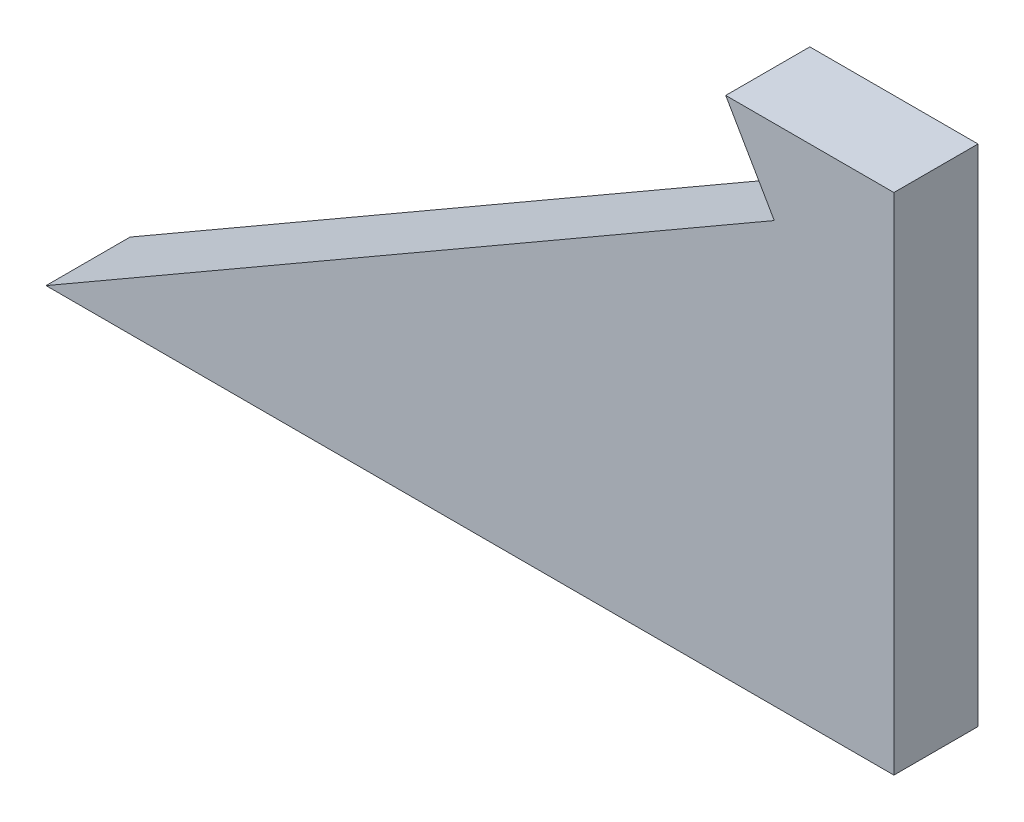
ISO-10303-21;
HEADER;
FILE_DESCRIPTION(('STEP AP214'),'2;1');
FILE_NAME('part.step','',(''),(''),'','','');
FILE_SCHEMA(('AUTOMOTIVE_DESIGN { 1 0 10303 214 1 1 1 1 }'));
ENDSEC;
DATA;
#1=APPLICATION_CONTEXT('core data for automotive mechanical design processes');
#2=APPLICATION_PROTOCOL_DEFINITION('international standard','automotive_design',2000,#1);
#3=PRODUCT_CONTEXT('',#1,'mechanical');
#4=PRODUCT('Part','Part','',(#3));
#5=PRODUCT_RELATED_PRODUCT_CATEGORY('part','',(#4));
#6=PRODUCT_DEFINITION_FORMATION('','',#4);
#7=PRODUCT_DEFINITION_CONTEXT('part definition',#1,'design');
#8=PRODUCT_DEFINITION('design','',#6,#7);
#9=PRODUCT_DEFINITION_SHAPE('','',#8);
#10=(LENGTH_UNIT() NAMED_UNIT(*) SI_UNIT(.MILLI.,.METRE.));
#11=(NAMED_UNIT(*) PLANE_ANGLE_UNIT() SI_UNIT($,.RADIAN.));
#12=(NAMED_UNIT(*) SI_UNIT($,.STERADIAN.) SOLID_ANGLE_UNIT());
#13=UNCERTAINTY_MEASURE_WITH_UNIT(LENGTH_MEASURE(1.E-05),#10,'distance_accuracy_value','');
#14=(GEOMETRIC_REPRESENTATION_CONTEXT(3) GLOBAL_UNCERTAINTY_ASSIGNED_CONTEXT((#13)) GLOBAL_UNIT_ASSIGNED_CONTEXT((#10,
#11,#12)) REPRESENTATION_CONTEXT('',''));
#15=CARTESIAN_POINT('',(0.,0.,0.));
#16=DIRECTION('',(0.,0.,1.));
#17=DIRECTION('',(1.,0.,0.));
#18=AXIS2_PLACEMENT_3D('',#15,#16,#17);
#19=CARTESIAN_POINT('',(0.,0.,-12.7));
#20=DIRECTION('',(-0.866025403784438,-0.500000000000002,0.));
#21=DIRECTION('',(0.500000000000002,-0.866025403784438,0.));
#22=AXIS2_PLACEMENT_3D('',#19,#20,#21);
#23=PLANE('',#22);
#24=DIRECTION('',(0.500000000000002,-0.866025403784438,0.));
#25=VECTOR('',#24,1.);
#26=CARTESIAN_POINT('',(0.,0.,12.7));
#27=LINE('',#26,#25);
#28=CARTESIAN_POINT('',(-14.6646968374164,25.3999999999997,12.7));
#29=VERTEX_POINT('',#28);
#30=CARTESIAN_POINT('',(0.,0.,12.7));
#31=VERTEX_POINT('',#30);
#32=EDGE_CURVE('E128',#29,#31,#27,.T.);
#33=ORIENTED_EDGE('',*,*,#32,.F.);
#34=DIRECTION('',(0.,0.,1.));
#35=VECTOR('',#34,1.);
#36=CARTESIAN_POINT('',(-14.6646968374164,25.3999999999997,-12.7));
#37=LINE('',#36,#35);
#38=CARTESIAN_POINT('',(-14.6646968374164,25.3999999999997,-12.7));
#39=VERTEX_POINT('',#38);
#40=EDGE_CURVE('E11',#39,#29,#37,.T.);
#41=ORIENTED_EDGE('',*,*,#40,.F.);
#42=DIRECTION('',(0.500000000000002,-0.866025403784438,0.));
#43=VECTOR('',#42,1.);
#44=CARTESIAN_POINT('',(0.,0.,-12.7));
#45=LINE('',#44,#43);
#46=CARTESIAN_POINT('',(0.,0.,-12.7));
#47=VERTEX_POINT('',#46);
#48=EDGE_CURVE('E122',#39,#47,#45,.T.);
#49=ORIENTED_EDGE('',*,*,#48,.T.);
#50=DIRECTION('',(0.,0.,1.));
#51=VECTOR('',#50,1.);
#52=CARTESIAN_POINT('',(0.,0.,-12.7));
#53=LINE('',#52,#51);
#54=EDGE_CURVE('E48',#47,#31,#53,.T.);
#55=ORIENTED_EDGE('',*,*,#54,.T.);
#56=EDGE_LOOP('',(#33,#41,#49,#55));
#57=FACE_BOUND('',#56,.T.);
#58=ADVANCED_FACE('F45',(#57),#23,.T.);
#59=CARTESIAN_POINT('',(-14.6646968374164,25.3999999999997,-12.7));
#60=DIRECTION('',(0.,1.,0.));
#61=DIRECTION('',(0.,0.,1.));
#62=AXIS2_PLACEMENT_3D('',#59,#60,#61);
#63=PLANE('',#62);
#64=DIRECTION('',(-1.,0.,0.));
#65=VECTOR('',#64,1.);
#66=CARTESIAN_POINT('',(-14.6646968374164,25.3999999999997,12.7));
#67=LINE('',#66,#65);
#68=CARTESIAN_POINT('',(36.1353031625836,25.3999999999997,12.7));
#69=VERTEX_POINT('',#68);
#70=EDGE_CURVE('E141',#69,#29,#67,.T.);
#71=ORIENTED_EDGE('',*,*,#70,.F.);
#72=DIRECTION('',(0.,0.,1.));
#73=VECTOR('',#72,1.);
#74=CARTESIAN_POINT('',(36.1353031625836,25.3999999999997,-12.7));
#75=LINE('',#74,#73);
#76=CARTESIAN_POINT('',(36.1353031625836,25.3999999999997,-12.7));
#77=VERTEX_POINT('',#76);
#78=EDGE_CURVE('E55',#77,#69,#75,.T.);
#79=ORIENTED_EDGE('',*,*,#78,.F.);
#80=DIRECTION('',(-1.,0.,0.));
#81=VECTOR('',#80,1.);
#82=CARTESIAN_POINT('',(-14.6646968374164,25.3999999999997,-12.7));
#83=LINE('',#82,#81);
#84=EDGE_CURVE('E114',#77,#39,#83,.T.);
#85=ORIENTED_EDGE('',*,*,#84,.T.);
#86=ORIENTED_EDGE('',*,*,#40,.T.);
#87=EDGE_LOOP('',(#71,#79,#85,#86));
#88=FACE_BOUND('',#87,.T.);
#89=ADVANCED_FACE('F151',(#88),#63,.T.);
#90=CARTESIAN_POINT('',(36.1353031625836,25.3999999999997,-12.7));
#91=DIRECTION('',(1.,0.,0.));
#92=DIRECTION('',(0.,1.,0.));
#93=AXIS2_PLACEMENT_3D('',#90,#91,#92);
#94=PLANE('',#93);
#95=DIRECTION('',(0.,1.,0.));
#96=VECTOR('',#95,1.);
#97=CARTESIAN_POINT('',(36.1353031625836,25.3999999999997,12.7));
#98=LINE('',#97,#96);
#99=CARTESIAN_POINT('',(36.1353031625837,-127.,12.7));
#100=VERTEX_POINT('',#99);
#101=EDGE_CURVE('E102',#100,#69,#98,.T.);
#102=ORIENTED_EDGE('',*,*,#101,.F.);
#103=DIRECTION('',(0.,0.,1.));
#104=VECTOR('',#103,1.);
#105=CARTESIAN_POINT('',(36.1353031625837,-127.,-12.7));
#106=LINE('',#105,#104);
#107=CARTESIAN_POINT('',(36.1353031625837,-127.,-12.7));
#108=VERTEX_POINT('',#107);
#109=EDGE_CURVE('E97',#108,#100,#106,.T.);
#110=ORIENTED_EDGE('',*,*,#109,.F.);
#111=DIRECTION('',(0.,1.,0.));
#112=VECTOR('',#111,1.);
#113=CARTESIAN_POINT('',(36.1353031625836,25.3999999999997,-12.7));
#114=LINE('',#113,#112);
#115=EDGE_CURVE('E100',#108,#77,#114,.T.);
#116=ORIENTED_EDGE('',*,*,#115,.T.);
#117=ORIENTED_EDGE('',*,*,#78,.T.);
#118=EDGE_LOOP('',(#102,#110,#116,#117));
#119=FACE_BOUND('',#118,.T.);
#120=ADVANCED_FACE('F99',(#119),#94,.T.);
#121=CARTESIAN_POINT('',(36.1353031625837,-127.,-12.7));
#122=DIRECTION('',(0.,-1.,0.));
#123=DIRECTION('',(1.,0.,0.));
#124=AXIS2_PLACEMENT_3D('',#121,#122,#123);
#125=PLANE('',#124);
#126=DIRECTION('',(1.,0.,0.));
#127=VECTOR('',#126,1.);
#128=CARTESIAN_POINT('',(36.1353031625837,-127.,12.7));
#129=LINE('',#128,#127);
#130=CARTESIAN_POINT('',(-219.970452561247,-127.,12.7));
#131=VERTEX_POINT('',#130);
#132=EDGE_CURVE('E136',#131,#100,#129,.T.);
#133=ORIENTED_EDGE('',*,*,#132,.F.);
#134=DIRECTION('',(0.,0.,1.));
#135=VECTOR('',#134,1.);
#136=CARTESIAN_POINT('',(-219.970452561247,-127.,-12.7));
#137=LINE('',#136,#135);
#138=CARTESIAN_POINT('',(-219.970452561247,-127.,-12.7));
#139=VERTEX_POINT('',#138);
#140=EDGE_CURVE('E108',#139,#131,#137,.T.);
#141=ORIENTED_EDGE('',*,*,#140,.F.);
#142=DIRECTION('',(1.,0.,0.));
#143=VECTOR('',#142,1.);
#144=CARTESIAN_POINT('',(36.1353031625837,-127.,-12.7));
#145=LINE('',#144,#143);
#146=EDGE_CURVE('E113',#139,#108,#145,.T.);
#147=ORIENTED_EDGE('',*,*,#146,.T.);
#148=ORIENTED_EDGE('',*,*,#109,.T.);
#149=EDGE_LOOP('',(#133,#141,#147,#148));
#150=FACE_BOUND('',#149,.T.);
#151=ADVANCED_FACE('F117',(#150),#125,.T.);
#152=CARTESIAN_POINT('',(0.,0.,-12.7));
#153=DIRECTION('',(-0.500000000000001,0.866025403784438,0.));
#154=DIRECTION('',(-0.866025403784438,-0.500000000000001,0.));
#155=AXIS2_PLACEMENT_3D('',#152,#153,#154);
#156=PLANE('',#155);
#157=DIRECTION('',(-0.866025403784438,-0.500000000000001,0.));
#158=VECTOR('',#157,1.);
#159=CARTESIAN_POINT('',(0.,0.,12.7));
#160=LINE('',#159,#158);
#161=EDGE_CURVE('E132',#31,#131,#160,.T.);
#162=ORIENTED_EDGE('',*,*,#161,.F.);
#163=ORIENTED_EDGE('',*,*,#54,.F.);
#164=DIRECTION('',(-0.866025403784438,-0.500000000000001,0.));
#165=VECTOR('',#164,1.);
#166=CARTESIAN_POINT('',(0.,0.,-12.7));
#167=LINE('',#166,#165);
#168=EDGE_CURVE('E119',#47,#139,#167,.T.);
#169=ORIENTED_EDGE('',*,*,#168,.T.);
#170=ORIENTED_EDGE('',*,*,#140,.T.);
#171=EDGE_LOOP('',(#162,#163,#169,#170));
#172=FACE_BOUND('',#171,.T.);
#173=ADVANCED_FACE('F148',(#172),#156,.T.);
#174=CARTESIAN_POINT('',(0.,0.,-12.7));
#175=DIRECTION('',(0.,0.,1.));
#176=DIRECTION('',(1.,0.,0.));
#177=AXIS2_PLACEMENT_3D('',#174,#175,#176);
#178=PLANE('',#177);
#179=ORIENTED_EDGE('',*,*,#48,.F.);
#180=ORIENTED_EDGE('',*,*,#84,.F.);
#181=ORIENTED_EDGE('',*,*,#115,.F.);
#182=ORIENTED_EDGE('',*,*,#146,.F.);
#183=ORIENTED_EDGE('',*,*,#168,.F.);
#184=EDGE_LOOP('',(#179,#180,#181,#182,#183));
#185=FACE_BOUND('',#184,.T.);
#186=ADVANCED_FACE('F112',(#185),#178,.F.);
#187=CARTESIAN_POINT('',(0.,0.,12.7));
#188=DIRECTION('',(0.,0.,1.));
#189=DIRECTION('',(1.,0.,0.));
#190=AXIS2_PLACEMENT_3D('',#187,#188,#189);
#191=PLANE('',#190);
#192=ORIENTED_EDGE('',*,*,#32,.T.);
#193=ORIENTED_EDGE('',*,*,#161,.T.);
#194=ORIENTED_EDGE('',*,*,#132,.T.);
#195=ORIENTED_EDGE('',*,*,#101,.T.);
#196=ORIENTED_EDGE('',*,*,#70,.T.);
#197=EDGE_LOOP('',(#192,#193,#194,#195,#196));
#198=FACE_BOUND('',#197,.T.);
#199=ADVANCED_FACE('F150',(#198),#191,.T.);
#200=CLOSED_SHELL('',(#58,#89,#120,#151,#173,#186,#199));
#201=MANIFOLD_SOLID_BREP('B2',#200);
#202=ADVANCED_BREP_SHAPE_REPRESENTATION('',(#18,#201),#14);
#203=SHAPE_DEFINITION_REPRESENTATION(#9,#202);
ENDSEC;
END-ISO-10303-21;
